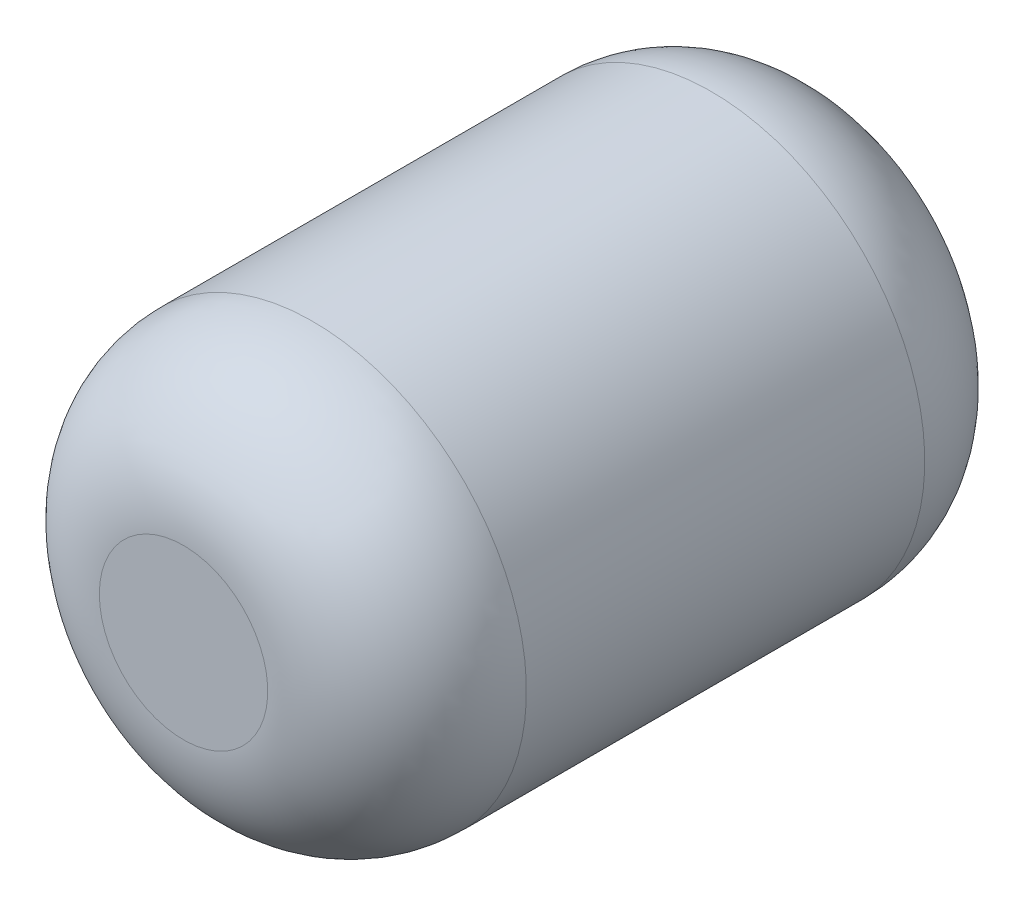
ISO-10303-21;
HEADER;
FILE_DESCRIPTION(('STEP AP214'),'2;1');
FILE_NAME('part.step','',(''),(''),'','','');
FILE_SCHEMA(('AUTOMOTIVE_DESIGN { 1 0 10303 214 1 1 1 1 }'));
ENDSEC;
DATA;
#1=APPLICATION_CONTEXT('core data for automotive mechanical design processes');
#2=APPLICATION_PROTOCOL_DEFINITION('international standard','automotive_design',2000,#1);
#3=PRODUCT_CONTEXT('',#1,'mechanical');
#4=PRODUCT('Part','Part','',(#3));
#5=PRODUCT_RELATED_PRODUCT_CATEGORY('part','',(#4));
#6=PRODUCT_DEFINITION_FORMATION('','',#4);
#7=PRODUCT_DEFINITION_CONTEXT('part definition',#1,'design');
#8=PRODUCT_DEFINITION('design','',#6,#7);
#9=PRODUCT_DEFINITION_SHAPE('','',#8);
#10=(LENGTH_UNIT() NAMED_UNIT(*) SI_UNIT(.MILLI.,.METRE.));
#11=(NAMED_UNIT(*) PLANE_ANGLE_UNIT() SI_UNIT($,.RADIAN.));
#12=(NAMED_UNIT(*) SI_UNIT($,.STERADIAN.) SOLID_ANGLE_UNIT());
#13=UNCERTAINTY_MEASURE_WITH_UNIT(LENGTH_MEASURE(1.E-05),#10,'distance_accuracy_value','');
#14=(GEOMETRIC_REPRESENTATION_CONTEXT(3) GLOBAL_UNCERTAINTY_ASSIGNED_CONTEXT((#13)) GLOBAL_UNIT_ASSIGNED_CONTEXT((#10,
#11,#12)) REPRESENTATION_CONTEXT('',''));
#15=CARTESIAN_POINT('',(0.,0.,0.));
#16=DIRECTION('',(0.,0.,1.));
#17=DIRECTION('',(1.,0.,0.));
#18=AXIS2_PLACEMENT_3D('',#15,#16,#17);
#19=CARTESIAN_POINT('',(0.,0.,127.));
#20=DIRECTION('',(0.,0.,1.));
#21=DIRECTION('',(1.,0.,0.));
#22=AXIS2_PLACEMENT_3D('',#19,#20,#21);
#23=PLANE('',#22);
#24=CARTESIAN_POINT('',(0.,0.,127.));
#25=DIRECTION('',(0.,0.,-1.));
#26=DIRECTION('',(-1.,0.,0.));
#27=AXIS2_PLACEMENT_3D('',#24,#25,#26);
#28=CIRCLE('',#27,32.55);
#29=CARTESIAN_POINT('',(-32.55,0.,127.));
#30=VERTEX_POINT('',#29);
#31=EDGE_CURVE('E10',#30,#30,#28,.T.);
#32=ORIENTED_EDGE('',*,*,#31,.F.);
#33=EDGE_LOOP('',(#32));
#34=FACE_BOUND('',#33,.T.);
#35=ADVANCED_FACE('F38',(#34),#23,.T.);
#36=CARTESIAN_POINT('',(0.,0.,77.));
#37=DIRECTION('',(0.,0.,-1.));
#38=DIRECTION('',(-1.,0.,0.));
#39=AXIS2_PLACEMENT_3D('',#36,#37,#38);
#40=DEGENERATE_TOROIDAL_SURFACE('',#39,32.55,50.,.T.);
#41=ORIENTED_EDGE('',*,*,#31,.T.);
#42=EDGE_LOOP('',(#41));
#43=FACE_BOUND('',#42,.T.);
#44=CARTESIAN_POINT('',(0.,0.,77.));
#45=DIRECTION('',(0.,0.,-1.));
#46=DIRECTION('',(-1.,0.,0.));
#47=AXIS2_PLACEMENT_3D('',#44,#45,#46);
#48=CIRCLE('',#47,82.55);
#49=CARTESIAN_POINT('',(-82.55,0.,77.));
#50=VERTEX_POINT('',#49);
#51=EDGE_CURVE('E46',#50,#50,#48,.T.);
#52=ORIENTED_EDGE('',*,*,#51,.F.);
#53=EDGE_LOOP('',(#52));
#54=FACE_BOUND('',#53,.T.);
#55=ADVANCED_FACE('F116',(#43,#54),#40,.T.);
#56=CARTESIAN_POINT('',(0.,0.,-193.42568819473));
#57=DIRECTION('',(0.,0.,-1.));
#58=DIRECTION('',(-1.,0.,0.));
#59=AXIS2_PLACEMENT_3D('',#56,#57,#58);
#60=CYLINDRICAL_SURFACE('',#59,82.55);
#61=ORIENTED_EDGE('',*,*,#51,.T.);
#62=EDGE_LOOP('',(#61));
#63=FACE_BOUND('',#62,.T.);
#64=CARTESIAN_POINT('',(0.,0.,-77.));
#65=DIRECTION('',(0.,0.,-1.));
#66=DIRECTION('',(-1.,0.,0.));
#67=AXIS2_PLACEMENT_3D('',#64,#65,#66);
#68=CIRCLE('',#67,82.55);
#69=CARTESIAN_POINT('',(-82.55,0.,-77.));
#70=VERTEX_POINT('',#69);
#71=EDGE_CURVE('E51',#70,#70,#68,.T.);
#72=ORIENTED_EDGE('',*,*,#71,.F.);
#73=EDGE_LOOP('',(#72));
#74=FACE_BOUND('',#73,.T.);
#75=ADVANCED_FACE('F113',(#63,#74),#60,.T.);
#76=CARTESIAN_POINT('',(0.,0.,-77.));
#77=DIRECTION('',(0.,0.,-1.));
#78=DIRECTION('',(-1.,0.,0.));
#79=AXIS2_PLACEMENT_3D('',#76,#77,#78);
#80=DEGENERATE_TOROIDAL_SURFACE('',#79,32.55,50.,.T.);
#81=ORIENTED_EDGE('',*,*,#71,.T.);
#82=EDGE_LOOP('',(#81));
#83=FACE_BOUND('',#82,.T.);
#84=CARTESIAN_POINT('',(0.,0.,-127.));
#85=DIRECTION('',(0.,0.,-1.));
#86=DIRECTION('',(-1.,0.,0.));
#87=AXIS2_PLACEMENT_3D('',#84,#85,#86);
#88=CIRCLE('',#87,32.55);
#89=CARTESIAN_POINT('',(-32.55,0.,-127.));
#90=VERTEX_POINT('',#89);
#91=EDGE_CURVE('E56',#90,#90,#88,.T.);
#92=ORIENTED_EDGE('',*,*,#91,.F.);
#93=EDGE_LOOP('',(#92));
#94=FACE_BOUND('',#93,.T.);
#95=ADVANCED_FACE('F109',(#83,#94),#80,.T.);
#96=CARTESIAN_POINT('',(0.,0.,-127.));
#97=DIRECTION('',(0.,0.,-1.));
#98=DIRECTION('',(-1.,0.,0.));
#99=AXIS2_PLACEMENT_3D('',#96,#97,#98);
#100=PLANE('',#99);
#101=ORIENTED_EDGE('',*,*,#91,.T.);
#102=EDGE_LOOP('',(#101));
#103=FACE_BOUND('',#102,.T.);
#104=ADVANCED_FACE('F107',(#103),#100,.T.);
#105=CLOSED_SHELL('',(#35,#55,#75,#95,#104));
#106=CARTESIAN_POINT('',(0.,0.,-122.));
#107=DIRECTION('',(0.,0.,1.));
#108=DIRECTION('',(1.,0.,0.));
#109=AXIS2_PLACEMENT_3D('',#106,#107,#108);
#110=PLANE('',#109);
#111=CARTESIAN_POINT('',(0.,0.,-122.));
#112=DIRECTION('',(0.,0.,-1.));
#113=DIRECTION('',(-1.,0.,0.));
#114=AXIS2_PLACEMENT_3D('',#111,#112,#113);
#115=CIRCLE('',#114,32.55);
#116=CARTESIAN_POINT('',(-32.55,0.,-122.));
#117=VERTEX_POINT('',#116);
#118=EDGE_CURVE('E62',#117,#117,#115,.T.);
#119=ORIENTED_EDGE('',*,*,#118,.F.);
#120=EDGE_LOOP('',(#119));
#121=FACE_BOUND('',#120,.T.);
#122=ADVANCED_FACE('F95',(#121),#110,.T.);
#123=CARTESIAN_POINT('',(0.,0.,-77.));
#124=DIRECTION('',(0.,0.,-1.));
#125=DIRECTION('',(-1.,0.,0.));
#126=AXIS2_PLACEMENT_3D('',#123,#124,#125);
#127=DEGENERATE_TOROIDAL_SURFACE('',#126,32.55,45.,.T.);
#128=ORIENTED_EDGE('',*,*,#118,.T.);
#129=EDGE_LOOP('',(#128));
#130=FACE_BOUND('',#129,.T.);
#131=CARTESIAN_POINT('',(0.,0.,-77.));
#132=DIRECTION('',(0.,0.,-1.));
#133=DIRECTION('',(-1.,0.,0.));
#134=AXIS2_PLACEMENT_3D('',#131,#132,#133);
#135=CIRCLE('',#134,77.55);
#136=CARTESIAN_POINT('',(-77.55,0.,-77.));
#137=VERTEX_POINT('',#136);
#138=EDGE_CURVE('E66',#137,#137,#135,.T.);
#139=ORIENTED_EDGE('',*,*,#138,.F.);
#140=EDGE_LOOP('',(#139));
#141=FACE_BOUND('',#140,.T.);
#142=ADVANCED_FACE('F92',(#130,#141),#127,.F.);
#143=CARTESIAN_POINT('',(0.,0.,-193.42568819473));
#144=DIRECTION('',(0.,0.,-1.));
#145=DIRECTION('',(-1.,0.,0.));
#146=AXIS2_PLACEMENT_3D('',#143,#144,#145);
#147=CYLINDRICAL_SURFACE('',#146,77.55);
#148=ORIENTED_EDGE('',*,*,#138,.T.);
#149=EDGE_LOOP('',(#148));
#150=FACE_BOUND('',#149,.T.);
#151=CARTESIAN_POINT('',(0.,0.,77.));
#152=DIRECTION('',(0.,0.,-1.));
#153=DIRECTION('',(-1.,0.,0.));
#154=AXIS2_PLACEMENT_3D('',#151,#152,#153);
#155=CIRCLE('',#154,77.55);
#156=CARTESIAN_POINT('',(-77.55,0.,77.));
#157=VERTEX_POINT('',#156);
#158=EDGE_CURVE('E70',#157,#157,#155,.T.);
#159=ORIENTED_EDGE('',*,*,#158,.F.);
#160=EDGE_LOOP('',(#159));
#161=FACE_BOUND('',#160,.T.);
#162=ADVANCED_FACE('F83',(#150,#161),#147,.F.);
#163=CARTESIAN_POINT('',(0.,0.,77.));
#164=DIRECTION('',(0.,0.,-1.));
#165=DIRECTION('',(-1.,0.,0.));
#166=AXIS2_PLACEMENT_3D('',#163,#164,#165);
#167=DEGENERATE_TOROIDAL_SURFACE('',#166,32.55,45.,.T.);
#168=ORIENTED_EDGE('',*,*,#158,.T.);
#169=EDGE_LOOP('',(#168));
#170=FACE_BOUND('',#169,.T.);
#171=CARTESIAN_POINT('',(0.,0.,122.));
#172=DIRECTION('',(0.,0.,-1.));
#173=DIRECTION('',(-1.,0.,0.));
#174=AXIS2_PLACEMENT_3D('',#171,#172,#173);
#175=CIRCLE('',#174,32.5499999999999);
#176=CARTESIAN_POINT('',(-32.5499999999999,0.,122.));
#177=VERTEX_POINT('',#176);
#178=EDGE_CURVE('E74',#177,#177,#175,.T.);
#179=ORIENTED_EDGE('',*,*,#178,.F.);
#180=EDGE_LOOP('',(#179));
#181=FACE_BOUND('',#180,.T.);
#182=ADVANCED_FACE('F81',(#170,#181),#167,.F.);
#183=CARTESIAN_POINT('',(0.,0.,122.));
#184=DIRECTION('',(0.,0.,-1.));
#185=DIRECTION('',(-1.,0.,0.));
#186=AXIS2_PLACEMENT_3D('',#183,#184,#185);
#187=PLANE('',#186);
#188=ORIENTED_EDGE('',*,*,#178,.T.);
#189=EDGE_LOOP('',(#188));
#190=FACE_BOUND('',#189,.T.);
#191=ADVANCED_FACE('F79',(#190),#187,.T.);
#192=CLOSED_SHELL('',(#122,#142,#162,#182,#191));
#193=ORIENTED_CLOSED_SHELL('',*,#192,.T.);
#194=BREP_WITH_VOIDS('B2',#105,(#193));
#195=ADVANCED_BREP_SHAPE_REPRESENTATION('',(#18,#194),#14);
#196=SHAPE_DEFINITION_REPRESENTATION(#9,#195);
ENDSEC;
END-ISO-10303-21;
